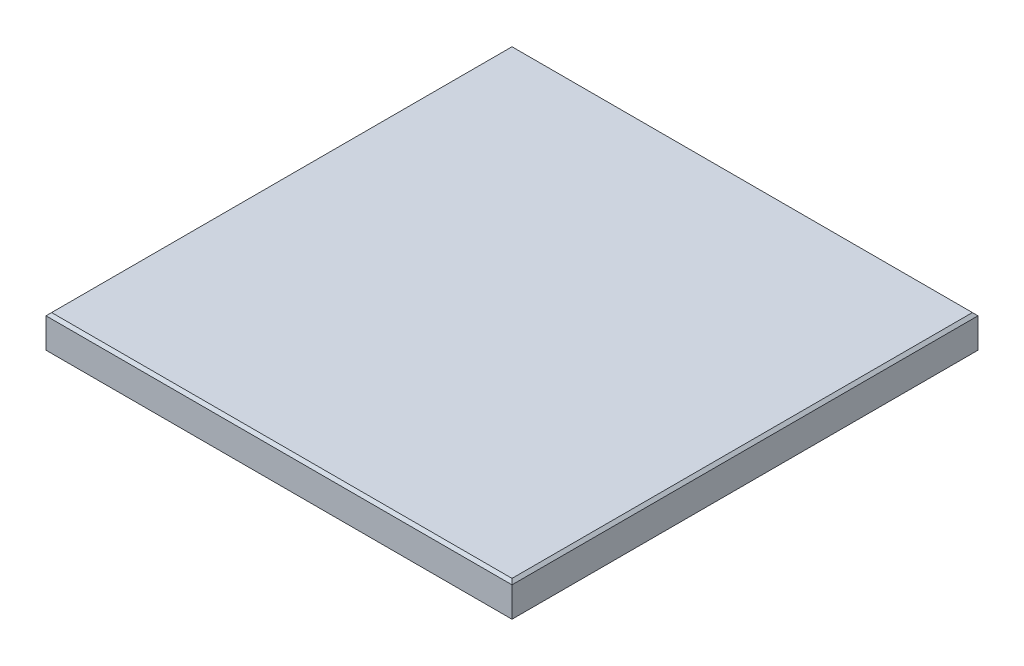
ISO-10303-21;
HEADER;
FILE_DESCRIPTION(('STEP AP214'),'2;1');
FILE_NAME('part.step','',(''),(''),'','','');
FILE_SCHEMA(('AUTOMOTIVE_DESIGN { 1 0 10303 214 1 1 1 1 }'));
ENDSEC;
DATA;
#1=APPLICATION_CONTEXT('core data for automotive mechanical design processes');
#2=APPLICATION_PROTOCOL_DEFINITION('international standard','automotive_design',2000,#1);
#3=PRODUCT_CONTEXT('',#1,'mechanical');
#4=PRODUCT('Part','Part','',(#3));
#5=PRODUCT_RELATED_PRODUCT_CATEGORY('part','',(#4));
#6=PRODUCT_DEFINITION_FORMATION('','',#4);
#7=PRODUCT_DEFINITION_CONTEXT('part definition',#1,'design');
#8=PRODUCT_DEFINITION('design','',#6,#7);
#9=PRODUCT_DEFINITION_SHAPE('','',#8);
#10=(LENGTH_UNIT() NAMED_UNIT(*) SI_UNIT(.MILLI.,.METRE.));
#11=(NAMED_UNIT(*) PLANE_ANGLE_UNIT() SI_UNIT($,.RADIAN.));
#12=(NAMED_UNIT(*) SI_UNIT($,.STERADIAN.) SOLID_ANGLE_UNIT());
#13=UNCERTAINTY_MEASURE_WITH_UNIT(LENGTH_MEASURE(1.E-05),#10,'distance_accuracy_value','');
#14=(GEOMETRIC_REPRESENTATION_CONTEXT(3) GLOBAL_UNCERTAINTY_ASSIGNED_CONTEXT((#13)) GLOBAL_UNIT_ASSIGNED_CONTEXT((#10,
#11,#12)) REPRESENTATION_CONTEXT('',''));
#15=CARTESIAN_POINT('',(0.,0.,0.));
#16=DIRECTION('',(0.,0.,1.));
#17=DIRECTION('',(1.,0.,0.));
#18=AXIS2_PLACEMENT_3D('',#15,#16,#17);
#19=CARTESIAN_POINT('',(63.5,15.24,63.5));
#20=DIRECTION('',(-1.,0.,0.));
#21=DIRECTION('',(0.,0.,1.));
#22=AXIS2_PLACEMENT_3D('',#19,#20,#21);
#23=PLANE('',#22);
#24=DIRECTION('',(0.,-1.,0.));
#25=VECTOR('',#24,1.);
#26=CARTESIAN_POINT('',(63.5,15.24,-63.5));
#27=LINE('',#26,#25);
#28=CARTESIAN_POINT('',(63.5,14.478,-63.5));
#29=VERTEX_POINT('',#28);
#30=CARTESIAN_POINT('',(63.5,6.35,-63.5));
#31=VERTEX_POINT('',#30);
#32=EDGE_CURVE('E184',#29,#31,#27,.T.);
#33=ORIENTED_EDGE('',*,*,#32,.F.);
#34=DIRECTION('',(0.,0.,1.));
#35=VECTOR('',#34,1.);
#36=CARTESIAN_POINT('',(63.5,14.478,63.5));
#37=LINE('',#36,#35);
#38=CARTESIAN_POINT('',(63.5,14.478,63.5));
#39=VERTEX_POINT('',#38);
#40=EDGE_CURVE('E73',#29,#39,#37,.T.);
#41=ORIENTED_EDGE('',*,*,#40,.T.);
#42=DIRECTION('',(0.,-1.,0.));
#43=VECTOR('',#42,1.);
#44=CARTESIAN_POINT('',(63.5,15.24,63.5));
#45=LINE('',#44,#43);
#46=CARTESIAN_POINT('',(63.5,6.35,63.5));
#47=VERTEX_POINT('',#46);
#48=EDGE_CURVE('E158',#39,#47,#45,.T.);
#49=ORIENTED_EDGE('',*,*,#48,.T.);
#50=DIRECTION('',(0.,0.,1.));
#51=VECTOR('',#50,1.);
#52=CARTESIAN_POINT('',(63.5,6.35,-63.5));
#53=LINE('',#52,#51);
#54=EDGE_CURVE('E168',#31,#47,#53,.T.);
#55=ORIENTED_EDGE('',*,*,#54,.F.);
#56=EDGE_LOOP('',(#33,#41,#49,#55));
#57=FACE_BOUND('',#56,.T.);
#58=ADVANCED_FACE('F47',(#57),#23,.F.);
#59=CARTESIAN_POINT('',(-63.5,15.24,-63.5));
#60=DIRECTION('',(0.,0.,1.));
#61=DIRECTION('',(1.,0.,0.));
#62=AXIS2_PLACEMENT_3D('',#59,#60,#61);
#63=PLANE('',#62);
#64=DIRECTION('',(0.,-1.,0.));
#65=VECTOR('',#64,1.);
#66=CARTESIAN_POINT('',(-63.5,15.24,-63.5));
#67=LINE('',#66,#65);
#68=CARTESIAN_POINT('',(-63.5,14.478,-63.5));
#69=VERTEX_POINT('',#68);
#70=CARTESIAN_POINT('',(-63.5,6.35,-63.5));
#71=VERTEX_POINT('',#70);
#72=EDGE_CURVE('E157',#69,#71,#67,.T.);
#73=ORIENTED_EDGE('',*,*,#72,.F.);
#74=DIRECTION('',(1.,0.,0.));
#75=VECTOR('',#74,1.);
#76=CARTESIAN_POINT('',(-63.5,14.478,-63.5));
#77=LINE('',#76,#75);
#78=EDGE_CURVE('E252',#69,#29,#77,.T.);
#79=ORIENTED_EDGE('',*,*,#78,.T.);
#80=ORIENTED_EDGE('',*,*,#32,.T.);
#81=DIRECTION('',(1.,0.,0.));
#82=VECTOR('',#81,1.);
#83=CARTESIAN_POINT('',(-63.5,6.35,-63.5));
#84=LINE('',#83,#82);
#85=EDGE_CURVE('E174',#71,#31,#84,.T.);
#86=ORIENTED_EDGE('',*,*,#85,.F.);
#87=EDGE_LOOP('',(#73,#79,#80,#86));
#88=FACE_BOUND('',#87,.T.);
#89=ADVANCED_FACE('F359',(#88),#63,.F.);
#90=CARTESIAN_POINT('',(-63.5,15.24,63.5));
#91=DIRECTION('',(1.,0.,0.));
#92=DIRECTION('',(0.,0.,-1.));
#93=AXIS2_PLACEMENT_3D('',#90,#91,#92);
#94=PLANE('',#93);
#95=DIRECTION('',(0.,-1.,0.));
#96=VECTOR('',#95,1.);
#97=CARTESIAN_POINT('',(-63.5,15.24,63.5));
#98=LINE('',#97,#96);
#99=CARTESIAN_POINT('',(-63.5,14.478,63.5));
#100=VERTEX_POINT('',#99);
#101=CARTESIAN_POINT('',(-63.5,6.35,63.5));
#102=VERTEX_POINT('',#101);
#103=EDGE_CURVE('E149',#100,#102,#98,.T.);
#104=ORIENTED_EDGE('',*,*,#103,.F.);
#105=DIRECTION('',(0.,0.,-1.));
#106=VECTOR('',#105,1.);
#107=CARTESIAN_POINT('',(-63.5,14.478,63.5));
#108=LINE('',#107,#106);
#109=EDGE_CURVE('E11',#100,#69,#108,.T.);
#110=ORIENTED_EDGE('',*,*,#109,.T.);
#111=ORIENTED_EDGE('',*,*,#72,.T.);
#112=DIRECTION('',(0.,0.,-1.));
#113=VECTOR('',#112,1.);
#114=CARTESIAN_POINT('',(-63.5,6.35,-63.5));
#115=LINE('',#114,#113);
#116=EDGE_CURVE('E165',#102,#71,#115,.T.);
#117=ORIENTED_EDGE('',*,*,#116,.F.);
#118=EDGE_LOOP('',(#104,#110,#111,#117));
#119=FACE_BOUND('',#118,.T.);
#120=ADVANCED_FACE('F171',(#119),#94,.F.);
#121=CARTESIAN_POINT('',(-63.5,15.24,63.5));
#122=DIRECTION('',(0.,0.,-1.));
#123=DIRECTION('',(-1.,0.,0.));
#124=AXIS2_PLACEMENT_3D('',#121,#122,#123);
#125=PLANE('',#124);
#126=ORIENTED_EDGE('',*,*,#48,.F.);
#127=DIRECTION('',(-1.,0.,0.));
#128=VECTOR('',#127,1.);
#129=CARTESIAN_POINT('',(-63.5,14.478,63.5));
#130=LINE('',#129,#128);
#131=EDGE_CURVE('E58',#39,#100,#130,.T.);
#132=ORIENTED_EDGE('',*,*,#131,.T.);
#133=ORIENTED_EDGE('',*,*,#103,.T.);
#134=DIRECTION('',(-1.,0.,0.));
#135=VECTOR('',#134,1.);
#136=CARTESIAN_POINT('',(-63.5,6.35,63.5));
#137=LINE('',#136,#135);
#138=EDGE_CURVE('E152',#47,#102,#137,.T.);
#139=ORIENTED_EDGE('',*,*,#138,.F.);
#140=EDGE_LOOP('',(#126,#132,#133,#139));
#141=FACE_BOUND('',#140,.T.);
#142=ADVANCED_FACE('F151',(#141),#125,.F.);
#143=CARTESIAN_POINT('',(0.,15.24,0.));
#144=DIRECTION('',(0.,-1.,0.));
#145=DIRECTION('',(0.,0.,-1.));
#146=AXIS2_PLACEMENT_3D('',#143,#144,#145);
#147=PLANE('',#146);
#148=DIRECTION('',(0.,0.,-1.));
#149=VECTOR('',#148,1.);
#150=CARTESIAN_POINT('',(62.738,15.24,0.));
#151=LINE('',#150,#149);
#152=CARTESIAN_POINT('',(62.738,15.24,62.738));
#153=VERTEX_POINT('',#152);
#154=CARTESIAN_POINT('',(62.738,15.24,-62.738));
#155=VERTEX_POINT('',#154);
#156=EDGE_CURVE('E245',#153,#155,#151,.T.);
#157=ORIENTED_EDGE('',*,*,#156,.T.);
#158=DIRECTION('',(-1.,0.,0.));
#159=VECTOR('',#158,1.);
#160=CARTESIAN_POINT('',(0.,15.24,-62.738));
#161=LINE('',#160,#159);
#162=CARTESIAN_POINT('',(-62.738,15.24,-62.738));
#163=VERTEX_POINT('',#162);
#164=EDGE_CURVE('E248',#155,#163,#161,.T.);
#165=ORIENTED_EDGE('',*,*,#164,.T.);
#166=DIRECTION('',(0.,0.,1.));
#167=VECTOR('',#166,1.);
#168=CARTESIAN_POINT('',(-62.738,15.24,0.));
#169=LINE('',#168,#167);
#170=CARTESIAN_POINT('',(-62.738,15.24,62.738));
#171=VERTEX_POINT('',#170);
#172=EDGE_CURVE('E239',#163,#171,#169,.T.);
#173=ORIENTED_EDGE('',*,*,#172,.T.);
#174=DIRECTION('',(1.,0.,0.));
#175=VECTOR('',#174,1.);
#176=CARTESIAN_POINT('',(0.,15.24,62.738));
#177=LINE('',#176,#175);
#178=EDGE_CURVE('E242',#171,#153,#177,.T.);
#179=ORIENTED_EDGE('',*,*,#178,.T.);
#180=EDGE_LOOP('',(#157,#165,#173,#179));
#181=FACE_BOUND('',#180,.T.);
#182=ADVANCED_FACE('F349',(#181),#147,.F.);
#183=CARTESIAN_POINT('',(0.,6.35,0.));
#184=DIRECTION('',(0.,1.,0.));
#185=DIRECTION('',(0.,0.,1.));
#186=AXIS2_PLACEMENT_3D('',#183,#184,#185);
#187=PLANE('',#186);
#188=DIRECTION('',(1.,0.,0.));
#189=VECTOR('',#188,1.);
#190=CARTESIAN_POINT('',(-50.165,6.35,-50.165));
#191=LINE('',#190,#189);
#192=CARTESIAN_POINT('',(-49.403,6.35,-50.165));
#193=VERTEX_POINT('',#192);
#194=CARTESIAN_POINT('',(49.403,6.35,-50.165));
#195=VERTEX_POINT('',#194);
#196=EDGE_CURVE('E297',#193,#195,#191,.T.);
#197=ORIENTED_EDGE('',*,*,#196,.F.);
#198=CARTESIAN_POINT('',(-49.403,6.35,-49.403));
#199=DIRECTION('',(0.,1.,0.));
#200=DIRECTION('',(0.,0.,1.));
#201=AXIS2_PLACEMENT_3D('',#198,#199,#200);
#202=CIRCLE('',#201,0.762);
#203=CARTESIAN_POINT('',(-50.165,6.35,-49.403));
#204=VERTEX_POINT('',#203);
#205=EDGE_CURVE('E227',#193,#204,#202,.T.);
#206=ORIENTED_EDGE('',*,*,#205,.T.);
#207=DIRECTION('',(0.,0.,-1.));
#208=VECTOR('',#207,1.);
#209=CARTESIAN_POINT('',(-50.165,6.35,50.165));
#210=LINE('',#209,#208);
#211=CARTESIAN_POINT('',(-50.165,6.35,49.403));
#212=VERTEX_POINT('',#211);
#213=EDGE_CURVE('E288',#212,#204,#210,.T.);
#214=ORIENTED_EDGE('',*,*,#213,.F.);
#215=CARTESIAN_POINT('',(-49.403,6.35,49.403));
#216=DIRECTION('',(0.,1.,0.));
#217=DIRECTION('',(0.,0.,1.));
#218=AXIS2_PLACEMENT_3D('',#215,#216,#217);
#219=CIRCLE('',#218,0.762);
#220=CARTESIAN_POINT('',(-49.403,6.35,50.165));
#221=VERTEX_POINT('',#220);
#222=EDGE_CURVE('E236',#212,#221,#219,.T.);
#223=ORIENTED_EDGE('',*,*,#222,.T.);
#224=DIRECTION('',(-1.,0.,0.));
#225=VECTOR('',#224,1.);
#226=CARTESIAN_POINT('',(50.165,6.35,50.165));
#227=LINE('',#226,#225);
#228=CARTESIAN_POINT('',(49.403,6.35,50.165));
#229=VERTEX_POINT('',#228);
#230=EDGE_CURVE('E301',#229,#221,#227,.T.);
#231=ORIENTED_EDGE('',*,*,#230,.F.);
#232=CARTESIAN_POINT('',(49.403,6.35,49.403));
#233=DIRECTION('',(0.,1.,0.));
#234=DIRECTION('',(0.,0.,1.));
#235=AXIS2_PLACEMENT_3D('',#232,#233,#234);
#236=CIRCLE('',#235,0.762);
#237=CARTESIAN_POINT('',(50.165,6.35,49.403));
#238=VERTEX_POINT('',#237);
#239=EDGE_CURVE('E233',#229,#238,#236,.T.);
#240=ORIENTED_EDGE('',*,*,#239,.T.);
#241=DIRECTION('',(0.,0.,1.));
#242=VECTOR('',#241,1.);
#243=CARTESIAN_POINT('',(50.165,6.35,-50.165));
#244=LINE('',#243,#242);
#245=CARTESIAN_POINT('',(50.165,6.35,-49.403));
#246=VERTEX_POINT('',#245);
#247=EDGE_CURVE('E307',#246,#238,#244,.T.);
#248=ORIENTED_EDGE('',*,*,#247,.F.);
#249=CARTESIAN_POINT('',(49.403,6.35,-49.403));
#250=DIRECTION('',(0.,1.,0.));
#251=DIRECTION('',(0.,0.,1.));
#252=AXIS2_PLACEMENT_3D('',#249,#250,#251);
#253=CIRCLE('',#252,0.762);
#254=EDGE_CURVE('E230',#246,#195,#253,.T.);
#255=ORIENTED_EDGE('',*,*,#254,.T.);
#256=EDGE_LOOP('',(#197,#206,#214,#223,#231,#240,#248,#255));
#257=FACE_BOUND('',#256,.T.);
#258=ORIENTED_EDGE('',*,*,#54,.T.);
#259=ORIENTED_EDGE('',*,*,#138,.T.);
#260=ORIENTED_EDGE('',*,*,#116,.T.);
#261=ORIENTED_EDGE('',*,*,#85,.T.);
#262=EDGE_LOOP('',(#258,#259,#260,#261));
#263=FACE_BOUND('',#262,.T.);
#264=ADVANCED_FACE('F163',(#257,#263),#187,.F.);
#265=CARTESIAN_POINT('',(-50.165,6.35,-50.165));
#266=DIRECTION('',(0.,0.,-1.));
#267=DIRECTION('',(-1.,0.,0.));
#268=AXIS2_PLACEMENT_3D('',#265,#266,#267);
#269=PLANE('',#268);
#270=DIRECTION('',(1.,0.,0.));
#271=VECTOR('',#270,1.);
#272=CARTESIAN_POINT('',(-50.165,0.,-50.165));
#273=LINE('',#272,#271);
#274=CARTESIAN_POINT('',(-49.403,0.,-50.165));
#275=VERTEX_POINT('',#274);
#276=CARTESIAN_POINT('',(49.403,0.,-50.165));
#277=VERTEX_POINT('',#276);
#278=EDGE_CURVE('E273',#275,#277,#273,.T.);
#279=ORIENTED_EDGE('',*,*,#278,.F.);
#280=DIRECTION('',(0.,-1.,0.));
#281=VECTOR('',#280,1.);
#282=CARTESIAN_POINT('',(-49.403,6.35,-50.165));
#283=LINE('',#282,#281);
#284=EDGE_CURVE('E210',#275,#193,#283,.F.);
#285=ORIENTED_EDGE('',*,*,#284,.T.);
#286=ORIENTED_EDGE('',*,*,#196,.T.);
#287=DIRECTION('',(0.,-1.,0.));
#288=VECTOR('',#287,1.);
#289=CARTESIAN_POINT('',(49.403,6.35,-50.165));
#290=LINE('',#289,#288);
#291=EDGE_CURVE('E206',#195,#277,#290,.T.);
#292=ORIENTED_EDGE('',*,*,#291,.T.);
#293=EDGE_LOOP('',(#279,#285,#286,#292));
#294=FACE_BOUND('',#293,.T.);
#295=ADVANCED_FACE('F320',(#294),#269,.T.);
#296=CARTESIAN_POINT('',(-50.165,6.35,50.165));
#297=DIRECTION('',(-1.,0.,0.));
#298=DIRECTION('',(0.,0.,1.));
#299=AXIS2_PLACEMENT_3D('',#296,#297,#298);
#300=PLANE('',#299);
#301=ORIENTED_EDGE('',*,*,#213,.T.);
#302=DIRECTION('',(0.,-1.,0.));
#303=VECTOR('',#302,1.);
#304=CARTESIAN_POINT('',(-50.165,6.35,-49.403));
#305=LINE('',#304,#303);
#306=CARTESIAN_POINT('',(-50.165,0.,-49.403));
#307=VERTEX_POINT('',#306);
#308=EDGE_CURVE('E190',#204,#307,#305,.T.);
#309=ORIENTED_EDGE('',*,*,#308,.T.);
#310=DIRECTION('',(0.,0.,-1.));
#311=VECTOR('',#310,1.);
#312=CARTESIAN_POINT('',(-50.165,0.,50.165));
#313=LINE('',#312,#311);
#314=CARTESIAN_POINT('',(-50.165,0.,49.403));
#315=VERTEX_POINT('',#314);
#316=EDGE_CURVE('E294',#315,#307,#313,.T.);
#317=ORIENTED_EDGE('',*,*,#316,.F.);
#318=DIRECTION('',(0.,-1.,0.));
#319=VECTOR('',#318,1.);
#320=CARTESIAN_POINT('',(-50.165,6.35,49.403));
#321=LINE('',#320,#319);
#322=EDGE_CURVE('E187',#315,#212,#321,.F.);
#323=ORIENTED_EDGE('',*,*,#322,.T.);
#324=EDGE_LOOP('',(#301,#309,#317,#323));
#325=FACE_BOUND('',#324,.T.);
#326=ADVANCED_FACE('F345',(#325),#300,.T.);
#327=CARTESIAN_POINT('',(50.165,6.35,50.165));
#328=DIRECTION('',(0.,0.,1.));
#329=DIRECTION('',(1.,0.,0.));
#330=AXIS2_PLACEMENT_3D('',#327,#328,#329);
#331=PLANE('',#330);
#332=DIRECTION('',(-1.,0.,0.));
#333=VECTOR('',#332,1.);
#334=CARTESIAN_POINT('',(50.165,0.,50.165));
#335=LINE('',#334,#333);
#336=CARTESIAN_POINT('',(49.403,0.,50.165));
#337=VERTEX_POINT('',#336);
#338=CARTESIAN_POINT('',(-49.403,0.,50.165));
#339=VERTEX_POINT('',#338);
#340=EDGE_CURVE('E285',#337,#339,#335,.T.);
#341=ORIENTED_EDGE('',*,*,#340,.F.);
#342=DIRECTION('',(0.,-1.,0.));
#343=VECTOR('',#342,1.);
#344=CARTESIAN_POINT('',(49.403,6.35,50.165));
#345=LINE('',#344,#343);
#346=EDGE_CURVE('E224',#337,#229,#345,.F.);
#347=ORIENTED_EDGE('',*,*,#346,.T.);
#348=ORIENTED_EDGE('',*,*,#230,.T.);
#349=DIRECTION('',(0.,-1.,0.));
#350=VECTOR('',#349,1.);
#351=CARTESIAN_POINT('',(-49.403,6.35,50.165));
#352=LINE('',#351,#350);
#353=EDGE_CURVE('E220',#221,#339,#352,.T.);
#354=ORIENTED_EDGE('',*,*,#353,.T.);
#355=EDGE_LOOP('',(#341,#347,#348,#354));
#356=FACE_BOUND('',#355,.T.);
#357=ADVANCED_FACE('F339',(#356),#331,.T.);
#358=CARTESIAN_POINT('',(50.165,6.35,-50.165));
#359=DIRECTION('',(1.,0.,0.));
#360=DIRECTION('',(0.,0.,-1.));
#361=AXIS2_PLACEMENT_3D('',#358,#359,#360);
#362=PLANE('',#361);
#363=DIRECTION('',(0.,0.,1.));
#364=VECTOR('',#363,1.);
#365=CARTESIAN_POINT('',(50.165,0.,-50.165));
#366=LINE('',#365,#364);
#367=CARTESIAN_POINT('',(50.165,0.,-49.403));
#368=VERTEX_POINT('',#367);
#369=CARTESIAN_POINT('',(50.165,0.,49.403));
#370=VERTEX_POINT('',#369);
#371=EDGE_CURVE('E279',#368,#370,#366,.T.);
#372=ORIENTED_EDGE('',*,*,#371,.F.);
#373=DIRECTION('',(0.,-1.,0.));
#374=VECTOR('',#373,1.);
#375=CARTESIAN_POINT('',(50.165,6.35,-49.403));
#376=LINE('',#375,#374);
#377=EDGE_CURVE('E217',#368,#246,#376,.F.);
#378=ORIENTED_EDGE('',*,*,#377,.T.);
#379=ORIENTED_EDGE('',*,*,#247,.T.);
#380=DIRECTION('',(0.,-1.,0.));
#381=VECTOR('',#380,1.);
#382=CARTESIAN_POINT('',(50.165,6.35,49.403));
#383=LINE('',#382,#381);
#384=EDGE_CURVE('E213',#238,#370,#383,.T.);
#385=ORIENTED_EDGE('',*,*,#384,.T.);
#386=EDGE_LOOP('',(#372,#378,#379,#385));
#387=FACE_BOUND('',#386,.T.);
#388=ADVANCED_FACE('F331',(#387),#362,.T.);
#389=CARTESIAN_POINT('',(0.,0.,0.));
#390=DIRECTION('',(0.,-1.,0.));
#391=DIRECTION('',(0.,0.,-1.));
#392=AXIS2_PLACEMENT_3D('',#389,#390,#391);
#393=PLANE('',#392);
#394=ORIENTED_EDGE('',*,*,#316,.T.);
#395=CARTESIAN_POINT('',(-49.403,0.,-49.403));
#396=DIRECTION('',(0.,-1.,0.));
#397=DIRECTION('',(0.,0.,-1.));
#398=AXIS2_PLACEMENT_3D('',#395,#396,#397);
#399=CIRCLE('',#398,0.762);
#400=EDGE_CURVE('E203',#307,#275,#399,.T.);
#401=ORIENTED_EDGE('',*,*,#400,.T.);
#402=ORIENTED_EDGE('',*,*,#278,.T.);
#403=CARTESIAN_POINT('',(49.403,0.,-49.403));
#404=DIRECTION('',(0.,-1.,0.));
#405=DIRECTION('',(0.,0.,-1.));
#406=AXIS2_PLACEMENT_3D('',#403,#404,#405);
#407=CIRCLE('',#406,0.762);
#408=EDGE_CURVE('E200',#277,#368,#407,.T.);
#409=ORIENTED_EDGE('',*,*,#408,.T.);
#410=ORIENTED_EDGE('',*,*,#371,.T.);
#411=CARTESIAN_POINT('',(49.403,0.,49.403));
#412=DIRECTION('',(0.,-1.,0.));
#413=DIRECTION('',(0.,0.,-1.));
#414=AXIS2_PLACEMENT_3D('',#411,#412,#413);
#415=CIRCLE('',#414,0.762);
#416=EDGE_CURVE('E197',#370,#337,#415,.T.);
#417=ORIENTED_EDGE('',*,*,#416,.T.);
#418=ORIENTED_EDGE('',*,*,#340,.T.);
#419=CARTESIAN_POINT('',(-49.403,0.,49.403));
#420=DIRECTION('',(0.,-1.,0.));
#421=DIRECTION('',(0.,0.,-1.));
#422=AXIS2_PLACEMENT_3D('',#419,#420,#421);
#423=CIRCLE('',#422,0.762);
#424=EDGE_CURVE('E194',#339,#315,#423,.T.);
#425=ORIENTED_EDGE('',*,*,#424,.T.);
#426=EDGE_LOOP('',(#394,#401,#402,#409,#410,#417,#418,#425));
#427=FACE_BOUND('',#426,.T.);
#428=ADVANCED_FACE('F329',(#427),#393,.T.);
#429=CARTESIAN_POINT('',(-49.403,6.35,-49.403));
#430=DIRECTION('',(0.,-1.,0.));
#431=DIRECTION('',(0.,0.,-1.));
#432=AXIS2_PLACEMENT_3D('',#429,#430,#431);
#433=CYLINDRICAL_SURFACE('',#432,0.762);
#434=ORIENTED_EDGE('',*,*,#205,.F.);
#435=ORIENTED_EDGE('',*,*,#284,.F.);
#436=ORIENTED_EDGE('',*,*,#400,.F.);
#437=ORIENTED_EDGE('',*,*,#308,.F.);
#438=EDGE_LOOP('',(#434,#435,#436,#437));
#439=FACE_BOUND('',#438,.T.);
#440=ADVANCED_FACE('F347',(#439),#433,.T.);
#441=CARTESIAN_POINT('',(49.403,6.35,-49.403));
#442=DIRECTION('',(0.,-1.,0.));
#443=DIRECTION('',(0.,0.,-1.));
#444=AXIS2_PLACEMENT_3D('',#441,#442,#443);
#445=CYLINDRICAL_SURFACE('',#444,0.762);
#446=ORIENTED_EDGE('',*,*,#254,.F.);
#447=ORIENTED_EDGE('',*,*,#377,.F.);
#448=ORIENTED_EDGE('',*,*,#408,.F.);
#449=ORIENTED_EDGE('',*,*,#291,.F.);
#450=EDGE_LOOP('',(#446,#447,#448,#449));
#451=FACE_BOUND('',#450,.T.);
#452=ADVANCED_FACE('F326',(#451),#445,.T.);
#453=CARTESIAN_POINT('',(49.403,6.35,49.403));
#454=DIRECTION('',(0.,-1.,0.));
#455=DIRECTION('',(0.,0.,-1.));
#456=AXIS2_PLACEMENT_3D('',#453,#454,#455);
#457=CYLINDRICAL_SURFACE('',#456,0.762);
#458=ORIENTED_EDGE('',*,*,#239,.F.);
#459=ORIENTED_EDGE('',*,*,#346,.F.);
#460=ORIENTED_EDGE('',*,*,#416,.F.);
#461=ORIENTED_EDGE('',*,*,#384,.F.);
#462=EDGE_LOOP('',(#458,#459,#460,#461));
#463=FACE_BOUND('',#462,.T.);
#464=ADVANCED_FACE('F336',(#463),#457,.T.);
#465=CARTESIAN_POINT('',(-49.403,6.35,49.403));
#466=DIRECTION('',(0.,-1.,0.));
#467=DIRECTION('',(0.,0.,-1.));
#468=AXIS2_PLACEMENT_3D('',#465,#466,#467);
#469=CYLINDRICAL_SURFACE('',#468,0.762);
#470=ORIENTED_EDGE('',*,*,#222,.F.);
#471=ORIENTED_EDGE('',*,*,#322,.F.);
#472=ORIENTED_EDGE('',*,*,#424,.F.);
#473=ORIENTED_EDGE('',*,*,#353,.F.);
#474=EDGE_LOOP('',(#470,#471,#472,#473));
#475=FACE_BOUND('',#474,.T.);
#476=ADVANCED_FACE('F342',(#475),#469,.T.);
#477=CARTESIAN_POINT('',(0.,15.24,62.738));
#478=DIRECTION('',(0.,-0.707106781186547,-0.707106781186547));
#479=DIRECTION('',(1.,0.,0.));
#480=AXIS2_PLACEMENT_3D('',#477,#478,#479);
#481=PLANE('',#480);
#482=DIRECTION('',(0.577350269189626,0.577350269189626,-0.577350269189626));
#483=VECTOR('',#482,1.);
#484=CARTESIAN_POINT('',(-41.8253333333333,36.1526666666667,41.8253333333333));
#485=LINE('',#484,#483);
#486=EDGE_CURVE('E265',#100,#171,#485,.T.);
#487=ORIENTED_EDGE('',*,*,#486,.F.);
#488=ORIENTED_EDGE('',*,*,#131,.F.);
#489=DIRECTION('',(-0.577350269189626,0.577350269189626,-0.577350269189626));
#490=VECTOR('',#489,1.);
#491=CARTESIAN_POINT('',(41.8253333333333,36.1526666666667,41.8253333333333));
#492=LINE('',#491,#490);
#493=EDGE_CURVE('E52',#153,#39,#492,.F.);
#494=ORIENTED_EDGE('',*,*,#493,.F.);
#495=ORIENTED_EDGE('',*,*,#178,.F.);
#496=EDGE_LOOP('',(#487,#488,#494,#495));
#497=FACE_BOUND('',#496,.T.);
#498=ADVANCED_FACE('F50',(#497),#481,.F.);
#499=CARTESIAN_POINT('',(62.738,15.24,0.));
#500=DIRECTION('',(-0.707106781186547,-0.707106781186547,0.));
#501=DIRECTION('',(0.,0.,-1.));
#502=AXIS2_PLACEMENT_3D('',#499,#500,#501);
#503=PLANE('',#502);
#504=ORIENTED_EDGE('',*,*,#493,.T.);
#505=ORIENTED_EDGE('',*,*,#40,.F.);
#506=DIRECTION('',(-0.577350269189626,0.577350269189626,0.577350269189626));
#507=VECTOR('',#506,1.);
#508=CARTESIAN_POINT('',(41.8253333333333,36.1526666666667,-41.8253333333333));
#509=LINE('',#508,#507);
#510=EDGE_CURVE('E263',#155,#29,#509,.F.);
#511=ORIENTED_EDGE('',*,*,#510,.F.);
#512=ORIENTED_EDGE('',*,*,#156,.F.);
#513=EDGE_LOOP('',(#504,#505,#511,#512));
#514=FACE_BOUND('',#513,.T.);
#515=ADVANCED_FACE('F389',(#514),#503,.F.);
#516=CARTESIAN_POINT('',(-62.738,15.24,0.));
#517=DIRECTION('',(0.707106781186547,-0.707106781186547,0.));
#518=DIRECTION('',(0.,0.,1.));
#519=AXIS2_PLACEMENT_3D('',#516,#517,#518);
#520=PLANE('',#519);
#521=ORIENTED_EDGE('',*,*,#486,.T.);
#522=ORIENTED_EDGE('',*,*,#172,.F.);
#523=DIRECTION('',(-0.577350269189626,-0.577350269189626,-0.577350269189626));
#524=VECTOR('',#523,1.);
#525=CARTESIAN_POINT('',(-41.8253333333333,36.1526666666667,-41.8253333333333));
#526=LINE('',#525,#524);
#527=EDGE_CURVE('E260',#69,#163,#526,.F.);
#528=ORIENTED_EDGE('',*,*,#527,.F.);
#529=ORIENTED_EDGE('',*,*,#109,.F.);
#530=EDGE_LOOP('',(#521,#522,#528,#529));
#531=FACE_BOUND('',#530,.T.);
#532=ADVANCED_FACE('F383',(#531),#520,.F.);
#533=CARTESIAN_POINT('',(0.,15.24,-62.738));
#534=DIRECTION('',(0.,-0.707106781186547,0.707106781186547));
#535=DIRECTION('',(-1.,0.,0.));
#536=AXIS2_PLACEMENT_3D('',#533,#534,#535);
#537=PLANE('',#536);
#538=ORIENTED_EDGE('',*,*,#510,.T.);
#539=ORIENTED_EDGE('',*,*,#78,.F.);
#540=ORIENTED_EDGE('',*,*,#527,.T.);
#541=ORIENTED_EDGE('',*,*,#164,.F.);
#542=EDGE_LOOP('',(#538,#539,#540,#541));
#543=FACE_BOUND('',#542,.T.);
#544=ADVANCED_FACE('F377',(#543),#537,.F.);
#545=CLOSED_SHELL('',(#58,#89,#120,#142,#182,#264,#295,#326,#357,#388,#428,#440,#452,#464,#476,
#498,#515,#532,#544));
#546=MANIFOLD_SOLID_BREP('B2',#545);
#547=ADVANCED_BREP_SHAPE_REPRESENTATION('',(#18,#546),#14);
#548=SHAPE_DEFINITION_REPRESENTATION(#9,#547);
ENDSEC;
END-ISO-10303-21;
